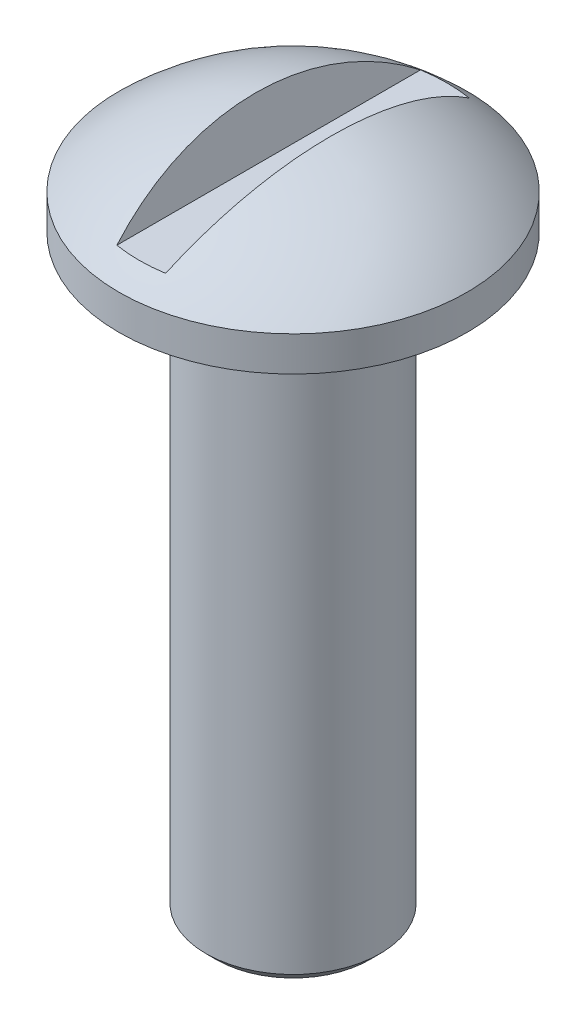
ISO-10303-21;
HEADER;
FILE_DESCRIPTION(('STEP AP214'),'2;1');
FILE_NAME('part.step','',(''),(''),'','','');
FILE_SCHEMA(('AUTOMOTIVE_DESIGN { 1 0 10303 214 1 1 1 1 }'));
ENDSEC;
DATA;
#1=APPLICATION_CONTEXT('core data for automotive mechanical design processes');
#2=APPLICATION_PROTOCOL_DEFINITION('international standard','automotive_design',2000,#1);
#3=PRODUCT_CONTEXT('',#1,'mechanical');
#4=PRODUCT('Part','Part','',(#3));
#5=PRODUCT_RELATED_PRODUCT_CATEGORY('part','',(#4));
#6=PRODUCT_DEFINITION_FORMATION('','',#4);
#7=PRODUCT_DEFINITION_CONTEXT('part definition',#1,'design');
#8=PRODUCT_DEFINITION('design','',#6,#7);
#9=PRODUCT_DEFINITION_SHAPE('','',#8);
#10=(LENGTH_UNIT() NAMED_UNIT(*) SI_UNIT(.MILLI.,.METRE.));
#11=(NAMED_UNIT(*) PLANE_ANGLE_UNIT() SI_UNIT($,.RADIAN.));
#12=(NAMED_UNIT(*) SI_UNIT($,.STERADIAN.) SOLID_ANGLE_UNIT());
#13=UNCERTAINTY_MEASURE_WITH_UNIT(LENGTH_MEASURE(1.E-05),#10,'distance_accuracy_value','');
#14=(GEOMETRIC_REPRESENTATION_CONTEXT(3) GLOBAL_UNCERTAINTY_ASSIGNED_CONTEXT((#13)) GLOBAL_UNIT_ASSIGNED_CONTEXT((#10,
#11,#12)) REPRESENTATION_CONTEXT('',''));
#15=CARTESIAN_POINT('',(0.,0.,0.));
#16=DIRECTION('',(0.,0.,1.));
#17=DIRECTION('',(1.,0.,0.));
#18=AXIS2_PLACEMENT_3D('',#15,#16,#17);
#19=CARTESIAN_POINT('',(0.,0.,0.));
#20=DIRECTION('',(0.,-1.,0.));
#21=DIRECTION('',(0.,0.,-1.));
#22=AXIS2_PLACEMENT_3D('',#19,#20,#21);
#23=PLANE('',#22);
#24=CARTESIAN_POINT('',(0.,0.,0.));
#25=DIRECTION('',(0.,-1.,0.));
#26=DIRECTION('',(0.,0.,-1.));
#27=AXIS2_PLACEMENT_3D('',#24,#25,#26);
#28=CIRCLE('',#27,5.588);
#29=CARTESIAN_POINT('',(0.,0.,5.588));
#30=VERTEX_POINT('',#29);
#31=EDGE_CURVE('E11',#30,#30,#28,.T.);
#32=ORIENTED_EDGE('',*,*,#31,.T.);
#33=EDGE_LOOP('',(#32));
#34=FACE_BOUND('',#33,.T.);
#35=ADVANCED_FACE('F47',(#34),#23,.T.);
#36=CARTESIAN_POINT('',(0.,0.,0.));
#37=DIRECTION('',(0.,1.,0.));
#38=DIRECTION('',(0.,0.,1.));
#39=AXIS2_PLACEMENT_3D('',#36,#37,#38);
#40=CYLINDRICAL_SURFACE('',#39,6.35);
#41=CARTESIAN_POINT('',(0.,0.761999999999993,0.));
#42=DIRECTION('',(0.,-1.,0.));
#43=DIRECTION('',(0.,0.,-1.));
#44=AXIS2_PLACEMENT_3D('',#41,#42,#43);
#45=CIRCLE('',#44,6.35);
#46=CARTESIAN_POINT('',(0.,0.761999999999993,6.35));
#47=VERTEX_POINT('',#46);
#48=EDGE_CURVE('E57',#47,#47,#45,.F.);
#49=ORIENTED_EDGE('',*,*,#48,.T.);
#50=EDGE_LOOP('',(#49));
#51=FACE_BOUND('',#50,.T.);
#52=CARTESIAN_POINT('',(0.,43.18,0.));
#53=DIRECTION('',(0.,1.,0.));
#54=DIRECTION('',(0.,0.,1.));
#55=AXIS2_PLACEMENT_3D('',#52,#53,#54);
#56=CIRCLE('',#55,6.34999999999999);
#57=CARTESIAN_POINT('',(0.,43.18,6.34999999999999));
#58=VERTEX_POINT('',#57);
#59=EDGE_CURVE('E82',#58,#58,#56,.T.);
#60=ORIENTED_EDGE('',*,*,#59,.F.);
#61=EDGE_LOOP('',(#60));
#62=FACE_BOUND('',#61,.T.);
#63=ADVANCED_FACE('F114',(#51,#62),#40,.T.);
#64=CARTESIAN_POINT('',(-6.34999999999999,43.18,0.));
#65=DIRECTION('',(0.,-1.,0.));
#66=DIRECTION('',(0.,0.,-1.));
#67=AXIS2_PLACEMENT_3D('',#64,#65,#66);
#68=PLANE('',#67);
#69=ORIENTED_EDGE('',*,*,#59,.T.);
#70=EDGE_LOOP('',(#69));
#71=FACE_BOUND('',#70,.T.);
#72=CARTESIAN_POINT('',(0.,43.18,0.));
#73=DIRECTION('',(0.,1.,0.));
#74=DIRECTION('',(0.,0.,1.));
#75=AXIS2_PLACEMENT_3D('',#72,#73,#74);
#76=CIRCLE('',#75,12.7);
#77=CARTESIAN_POINT('',(0.,43.18,12.7));
#78=VERTEX_POINT('',#77);
#79=EDGE_CURVE('E99',#78,#78,#76,.T.);
#80=ORIENTED_EDGE('',*,*,#79,.F.);
#81=EDGE_LOOP('',(#80));
#82=FACE_BOUND('',#81,.T.);
#83=ADVANCED_FACE('F130',(#71,#82),#68,.T.);
#84=CARTESIAN_POINT('',(0.,0.,0.));
#85=DIRECTION('',(0.,1.,0.));
#86=DIRECTION('',(0.,0.,1.));
#87=AXIS2_PLACEMENT_3D('',#84,#85,#86);
#88=CYLINDRICAL_SURFACE('',#87,12.7);
#89=ORIENTED_EDGE('',*,*,#79,.T.);
#90=EDGE_LOOP('',(#89));
#91=FACE_BOUND('',#90,.T.);
#92=CARTESIAN_POINT('',(0.,45.72,0.));
#93=DIRECTION('',(0.,1.,0.));
#94=DIRECTION('',(0.,0.,1.));
#95=AXIS2_PLACEMENT_3D('',#92,#93,#94);
#96=CIRCLE('',#95,12.7);
#97=CARTESIAN_POINT('',(0.,45.72,12.7));
#98=VERTEX_POINT('',#97);
#99=EDGE_CURVE('E96',#98,#98,#96,.T.);
#100=ORIENTED_EDGE('',*,*,#99,.F.);
#101=EDGE_LOOP('',(#100));
#102=FACE_BOUND('',#101,.T.);
#103=ADVANCED_FACE('F135',(#91,#102),#88,.T.);
#104=CARTESIAN_POINT('',(0.,32.385,0.));
#105=DIRECTION('',(0.,0.,1.));
#106=DIRECTION('',(1.,0.,0.));
#107=AXIS2_PLACEMENT_3D('',#104,#105,#106);
#108=SPHERICAL_SURFACE('',#107,18.415);
#109=CARTESIAN_POINT('',(1.99359531076813,32.9191822535548,0.));
#110=DIRECTION('',(-0.96592582628907,-0.258819045102515,0.));
#111=DIRECTION('',(0.258819045102515,-0.96592582628907,0.));
#112=AXIS2_PLACEMENT_3D('',#109,#110,#111);
#113=CIRCLE('',#112,18.2989740711569);
#114=CARTESIAN_POINT('',(-1.77666894123729,46.99,-11.0747301309442));
#115=VERTEX_POINT('',#114);
#116=CARTESIAN_POINT('',(-1.77666894123729,46.99,11.0747301309442));
#117=VERTEX_POINT('',#116);
#118=EDGE_CURVE('E64',#115,#117,#113,.F.);
#119=ORIENTED_EDGE('',*,*,#118,.F.);
#120=CARTESIAN_POINT('',(1.14081518637894E-13,46.99,0.));
#121=DIRECTION('',(0.,-1.,0.));
#122=DIRECTION('',(1.,0.,0.));
#123=AXIS2_PLACEMENT_3D('',#120,#121,#122);
#124=CIRCLE('',#123,11.2163363002364);
#125=CARTESIAN_POINT('',(1.77666894123729,46.99,-11.0747301309442));
#126=VERTEX_POINT('',#125);
#127=EDGE_CURVE('E77',#126,#115,#124,.F.);
#128=ORIENTED_EDGE('',*,*,#127,.F.);
#129=CARTESIAN_POINT('',(-1.99359531076812,32.9191822535548,0.));
#130=DIRECTION('',(0.96592582628907,-0.258819045102515,0.));
#131=DIRECTION('',(0.258819045102515,0.96592582628907,0.));
#132=AXIS2_PLACEMENT_3D('',#129,#130,#131);
#133=CIRCLE('',#132,18.2989740711569);
#134=CARTESIAN_POINT('',(1.77666894123729,46.99,11.0747301309442));
#135=VERTEX_POINT('',#134);
#136=EDGE_CURVE('E74',#135,#126,#133,.F.);
#137=ORIENTED_EDGE('',*,*,#136,.F.);
#138=EDGE_CURVE('E69',#117,#135,#124,.F.);
#139=ORIENTED_EDGE('',*,*,#138,.F.);
#140=EDGE_LOOP('',(#119,#128,#137,#139));
#141=FACE_BOUND('',#140,.T.);
#142=ORIENTED_EDGE('',*,*,#99,.T.);
#143=EDGE_LOOP('',(#142));
#144=FACE_BOUND('',#143,.T.);
#145=ADVANCED_FACE('F75',(#141,#144),#108,.T.);
#146=CARTESIAN_POINT('',(-2.74252768468437,50.5946339034792,85.7087993333659));
#147=DIRECTION('',(-0.96592582628907,-0.258819045102515,0.));
#148=DIRECTION('',(0.258819045102515,-0.96592582628907,0.));
#149=AXIS2_PLACEMENT_3D('',#146,#147,#148);
#150=PLANE('',#149);
#151=DIRECTION('',(0.,0.,-1.));
#152=VECTOR('',#151,1.);
#153=CARTESIAN_POINT('',(-1.77666894123729,46.99,85.7087993333659));
#154=LINE('',#153,#152);
#155=EDGE_CURVE('E89',#117,#115,#154,.T.);
#156=ORIENTED_EDGE('',*,*,#155,.T.);
#157=ORIENTED_EDGE('',*,*,#118,.T.);
#158=EDGE_LOOP('',(#156,#157));
#159=FACE_BOUND('',#158,.T.);
#160=ADVANCED_FACE('F134',(#159),#150,.F.);
#161=CARTESIAN_POINT('',(-1.77666894123729,46.99,85.7087993333659));
#162=DIRECTION('',(0.,-1.,0.));
#163=DIRECTION('',(1.,0.,0.));
#164=AXIS2_PLACEMENT_3D('',#161,#162,#163);
#165=PLANE('',#164);
#166=DIRECTION('',(0.,0.,-1.));
#167=VECTOR('',#166,1.);
#168=CARTESIAN_POINT('',(1.77666894123729,46.99,85.7087993333659));
#169=LINE('',#168,#167);
#170=EDGE_CURVE('E87',#135,#126,#169,.T.);
#171=ORIENTED_EDGE('',*,*,#170,.T.);
#172=ORIENTED_EDGE('',*,*,#127,.T.);
#173=ORIENTED_EDGE('',*,*,#155,.F.);
#174=ORIENTED_EDGE('',*,*,#138,.T.);
#175=EDGE_LOOP('',(#171,#172,#173,#174));
#176=FACE_BOUND('',#175,.T.);
#177=ADVANCED_FACE('F86',(#176),#165,.F.);
#178=CARTESIAN_POINT('',(2.74252768468437,50.5946339034792,85.7087993333659));
#179=DIRECTION('',(0.96592582628907,-0.258819045102515,0.));
#180=DIRECTION('',(0.258819045102515,0.96592582628907,0.));
#181=AXIS2_PLACEMENT_3D('',#178,#179,#180);
#182=PLANE('',#181);
#183=ORIENTED_EDGE('',*,*,#136,.T.);
#184=ORIENTED_EDGE('',*,*,#170,.F.);
#185=EDGE_LOOP('',(#183,#184));
#186=FACE_BOUND('',#185,.T.);
#187=ADVANCED_FACE('F92',(#186),#182,.F.);
#188=CARTESIAN_POINT('',(0.,0.761999999999993,0.));
#189=DIRECTION('',(0.,1.,0.));
#190=DIRECTION('',(0.,0.,1.));
#191=AXIS2_PLACEMENT_3D('',#188,#189,#190);
#192=CONICAL_SURFACE('',#191,6.35,0.785398163397449);
#193=CARTESIAN_POINT('',(0.,0.,5.588));
#194=CARTESIAN_POINT('',(0.,0.00793750000000024,5.5959375));
#195=CARTESIAN_POINT('',(0.,0.0158750000000001,5.603875));
#196=CARTESIAN_POINT('',(0.,0.0317499999999998,5.61975));
#197=CARTESIAN_POINT('',(0.,0.0396874999999996,5.6276875));
#198=CARTESIAN_POINT('',(0.,0.0555624999999995,5.6435625));
#199=CARTESIAN_POINT('',(0.,0.0634999999999995,5.6515));
#200=CARTESIAN_POINT('',(0.,0.0793749999999994,5.667375));
#201=CARTESIAN_POINT('',(0.,0.0873124999999994,5.6753125));
#202=CARTESIAN_POINT('',(0.,0.103187499999999,5.6911875));
#203=CARTESIAN_POINT('',(0.,0.111124999999999,5.699125));
#204=CARTESIAN_POINT('',(0.,0.126999999999999,5.715));
#205=CARTESIAN_POINT('',(0.,0.134937499999999,5.7229375));
#206=CARTESIAN_POINT('',(0.,0.150812499999999,5.7388125));
#207=CARTESIAN_POINT('',(0.,0.158749999999999,5.74675));
#208=CARTESIAN_POINT('',(0.,0.174624999999999,5.762625));
#209=CARTESIAN_POINT('',(0.,0.182562499999998,5.7705625));
#210=CARTESIAN_POINT('',(0.,0.198437499999998,5.7864375));
#211=CARTESIAN_POINT('',(0.,0.206374999999998,5.794375));
#212=CARTESIAN_POINT('',(0.,0.222249999999998,5.81025));
#213=CARTESIAN_POINT('',(0.,0.230187499999998,5.8181875));
#214=CARTESIAN_POINT('',(0.,0.246062499999998,5.8340625));
#215=CARTESIAN_POINT('',(0.,0.253999999999998,5.842));
#216=CARTESIAN_POINT('',(0.,0.269874999999997,5.857875));
#217=CARTESIAN_POINT('',(0.,0.277812499999997,5.8658125));
#218=CARTESIAN_POINT('',(0.,0.293687499999997,5.8816875));
#219=CARTESIAN_POINT('',(0.,0.301624999999997,5.889625));
#220=CARTESIAN_POINT('',(0.,0.317499999999997,5.9055));
#221=CARTESIAN_POINT('',(0.,0.325437499999997,5.9134375));
#222=CARTESIAN_POINT('',(0.,0.341312499999997,5.9293125));
#223=CARTESIAN_POINT('',(0.,0.349249999999997,5.93725));
#224=CARTESIAN_POINT('',(0.,0.365124999999997,5.953125));
#225=CARTESIAN_POINT('',(0.,0.373062499999996,5.9610625));
#226=CARTESIAN_POINT('',(0.,0.388937499999996,5.9769375));
#227=CARTESIAN_POINT('',(0.,0.396874999999996,5.984875));
#228=CARTESIAN_POINT('',(0.,0.412749999999996,6.00075));
#229=CARTESIAN_POINT('',(0.,0.420687499999996,6.0086875));
#230=CARTESIAN_POINT('',(0.,0.436562499999996,6.0245625));
#231=CARTESIAN_POINT('',(0.,0.444499999999996,6.0325));
#232=CARTESIAN_POINT('',(0.,0.460374999999996,6.048375));
#233=CARTESIAN_POINT('',(0.,0.468312499999996,6.0563125));
#234=CARTESIAN_POINT('',(0.,0.484187499999995,6.0721875));
#235=CARTESIAN_POINT('',(0.,0.492124999999995,6.080125));
#236=CARTESIAN_POINT('',(0.,0.507999999999995,6.096));
#237=CARTESIAN_POINT('',(0.,0.515937499999995,6.1039375));
#238=CARTESIAN_POINT('',(0.,0.531812499999995,6.1198125));
#239=CARTESIAN_POINT('',(0.,0.539749999999995,6.12775));
#240=CARTESIAN_POINT('',(0.,0.555624999999995,6.143625));
#241=CARTESIAN_POINT('',(0.,0.563562499999995,6.1515625));
#242=CARTESIAN_POINT('',(0.,0.579437499999994,6.1674375));
#243=CARTESIAN_POINT('',(0.,0.587374999999994,6.175375));
#244=CARTESIAN_POINT('',(0.,0.603249999999994,6.19125));
#245=CARTESIAN_POINT('',(0.,0.611187499999994,6.1991875));
#246=CARTESIAN_POINT('',(0.,0.627062499999994,6.2150625));
#247=CARTESIAN_POINT('',(0.,0.634999999999994,6.223));
#248=CARTESIAN_POINT('',(0.,0.650874999999994,6.238875));
#249=CARTESIAN_POINT('',(0.,0.658812499999994,6.2468125));
#250=CARTESIAN_POINT('',(0.,0.674687499999993,6.2626875));
#251=CARTESIAN_POINT('',(0.,0.682624999999993,6.270625));
#252=CARTESIAN_POINT('',(0.,0.698499999999993,6.2865));
#253=CARTESIAN_POINT('',(0.,0.706437499999993,6.2944375));
#254=CARTESIAN_POINT('',(0.,0.722312499999993,6.3103125));
#255=CARTESIAN_POINT('',(0.,0.730249999999993,6.31825));
#256=CARTESIAN_POINT('',(0.,0.746124999999993,6.334125));
#257=CARTESIAN_POINT('',(0.,0.754062499999993,6.3420625));
#258=CARTESIAN_POINT('',(0.,0.761999999999993,6.35));
#259=B_SPLINE_CURVE_WITH_KNOTS('',3,(#193,#194,#195,#196,#197,#198,#199,#200,#201,#202,#203,
#204,#205,#206,#207,#208,#209,#210,#211,#212,#213,#214,#215,#216,#217,#218,#219,#220,#221,#222,
#223,#224,#225,#226,#227,#228,#229,#230,#231,#232,#233,#234,#235,#236,#237,#238,#239,#240,#241,
#242,#243,#244,#245,#246,#247,#248,#249,#250,#251,#252,#253,#254,#255,#256,#257,#258),
.UNSPECIFIED.,.F.,.F.,(4,2,2,2,2,2,2,2,2,2,2,2,2,2,2,2,2,2,2,2,2,2,2,2,2,2,2,2,2,2,2,2,4),(0.,
0.0336759604540088,0.0673519209080182,0.101027881362027,0.134703841816036,0.168379802270045,
0.202055762724054,0.235731723178063,0.269407683632073,0.303083644086081,0.33675960454009,
0.3704355649941,0.404111525448108,0.437787485902117,0.471463446356127,0.505139406810135,
0.538815367264145,0.572491327718154,0.606167288172162,0.639843248626172,0.673519209080181,
0.707195169534189,0.740871129988199,0.774547090442208,0.808223050896217,0.841899011350226,
0.875574971804235,0.909250932258244,0.942926892712253,0.976602853166262,1.01027881362027,
1.04395477407428,1.07763073452829),.UNSPECIFIED.);
#260=EDGE_CURVE('BSEAM50',#30,#47,#259,.T.);
#261=ORIENTED_EDGE('',*,*,#31,.F.);
#262=ORIENTED_EDGE('',*,*,#48,.F.);
#263=ORIENTED_EDGE('',*,*,#260,.T.);
#264=ORIENTED_EDGE('',*,*,#260,.F.);
#265=EDGE_LOOP('',(#261,#263,#262,#264));
#266=FACE_BOUND('',#265,.T.);
#267=ADVANCED_FACE('F50',(#266),#192,.T.);
#268=CLOSED_SHELL('',(#35,#63,#83,#103,#145,#160,#177,#187,#267));
#269=MANIFOLD_SOLID_BREP('B2',#268);
#270=ADVANCED_BREP_SHAPE_REPRESENTATION('',(#18,#269),#14);
#271=SHAPE_DEFINITION_REPRESENTATION(#9,#270);
ENDSEC;
END-ISO-10303-21;
